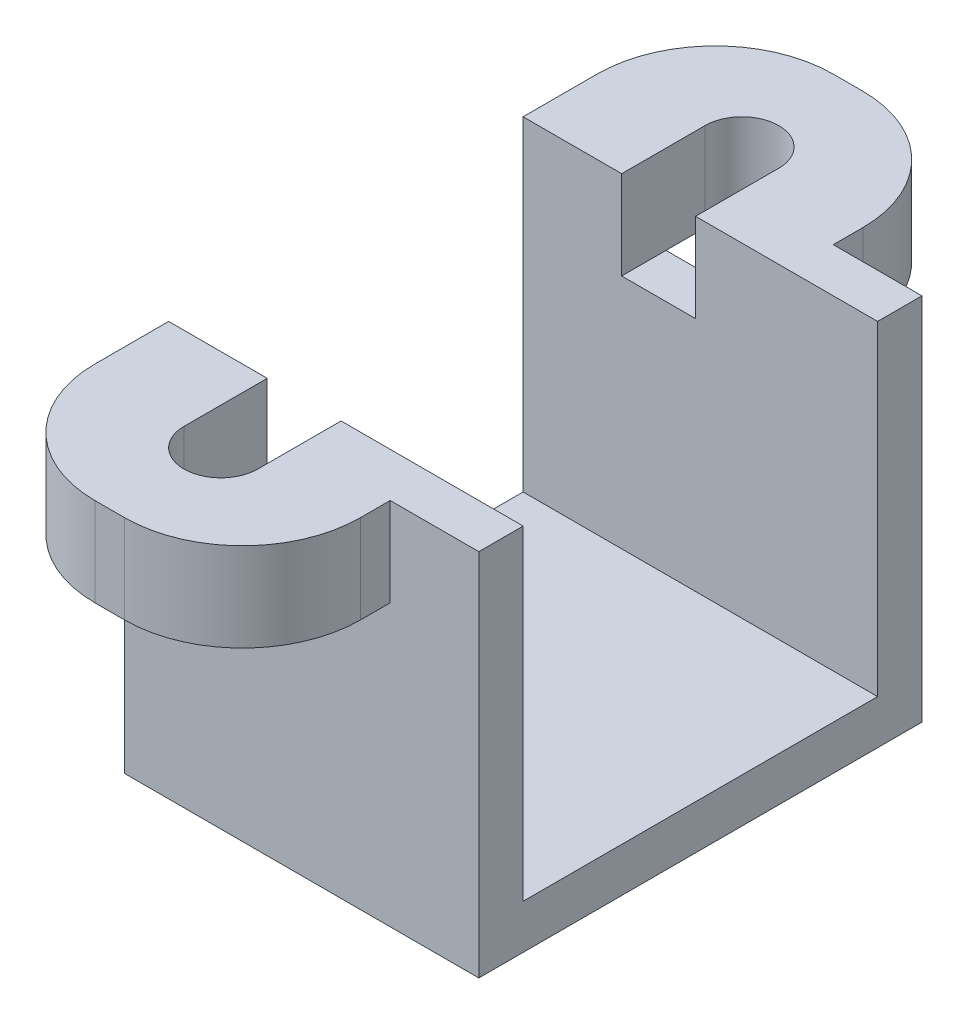
ISO-10303-21;
HEADER;
FILE_DESCRIPTION(('STEP AP214'),'2;1');
FILE_NAME('part.step','',(''),(''),'','','');
FILE_SCHEMA(('AUTOMOTIVE_DESIGN { 1 0 10303 214 1 1 1 1 }'));
ENDSEC;
DATA;
#1=APPLICATION_CONTEXT('core data for automotive mechanical design processes');
#2=APPLICATION_PROTOCOL_DEFINITION('international standard','automotive_design',2000,#1);
#3=PRODUCT_CONTEXT('',#1,'mechanical');
#4=PRODUCT('Part','Part','',(#3));
#5=PRODUCT_RELATED_PRODUCT_CATEGORY('part','',(#4));
#6=PRODUCT_DEFINITION_FORMATION('','',#4);
#7=PRODUCT_DEFINITION_CONTEXT('part definition',#1,'design');
#8=PRODUCT_DEFINITION('design','',#6,#7);
#9=PRODUCT_DEFINITION_SHAPE('','',#8);
#10=(LENGTH_UNIT() NAMED_UNIT(*) SI_UNIT(.MILLI.,.METRE.));
#11=(NAMED_UNIT(*) PLANE_ANGLE_UNIT() SI_UNIT($,.RADIAN.));
#12=(NAMED_UNIT(*) SI_UNIT($,.STERADIAN.) SOLID_ANGLE_UNIT());
#13=UNCERTAINTY_MEASURE_WITH_UNIT(LENGTH_MEASURE(1.E-05),#10,'distance_accuracy_value','');
#14=(GEOMETRIC_REPRESENTATION_CONTEXT(3) GLOBAL_UNCERTAINTY_ASSIGNED_CONTEXT((#13)) GLOBAL_UNIT_ASSIGNED_CONTEXT((#10,
#11,#12)) REPRESENTATION_CONTEXT('',''));
#15=CARTESIAN_POINT('',(0.,0.,0.));
#16=DIRECTION('',(0.,0.,1.));
#17=DIRECTION('',(1.,0.,0.));
#18=AXIS2_PLACEMENT_3D('',#15,#16,#17);
#19=CARTESIAN_POINT('',(-6.,12.5,-6.));
#20=DIRECTION('',(0.,0.,-1.));
#21=DIRECTION('',(-1.,0.,0.));
#22=AXIS2_PLACEMENT_3D('',#19,#20,#21);
#23=PLANE('',#22);
#24=DIRECTION('',(0.,-1.,0.));
#25=VECTOR('',#24,1.);
#26=CARTESIAN_POINT('',(-2.66316566960982,12.500012,-6.));
#27=LINE('',#26,#25);
#28=CARTESIAN_POINT('',(-2.66316566960982,12.5,-6.));
#29=VERTEX_POINT('',#28);
#30=CARTESIAN_POINT('',(-2.66316566960982,9.5,-6.));
#31=VERTEX_POINT('',#30);
#32=EDGE_CURVE('E220',#29,#31,#27,.T.);
#33=ORIENTED_EDGE('',*,*,#32,.F.);
#34=DIRECTION('',(1.,0.,0.));
#35=VECTOR('',#34,1.);
#36=CARTESIAN_POINT('',(-6.,12.5,-6.));
#37=LINE('',#36,#35);
#38=CARTESIAN_POINT('',(-6.,12.5,-6.));
#39=VERTEX_POINT('',#38);
#40=EDGE_CURVE('E350',#39,#29,#37,.T.);
#41=ORIENTED_EDGE('',*,*,#40,.F.);
#42=DIRECTION('',(0.,-1.,0.));
#43=VECTOR('',#42,1.);
#44=CARTESIAN_POINT('',(-6.,12.5,-6.));
#45=LINE('',#44,#43);
#46=CARTESIAN_POINT('',(-6.,1.5,-6.));
#47=VERTEX_POINT('',#46);
#48=EDGE_CURVE('E363',#39,#47,#45,.T.);
#49=ORIENTED_EDGE('',*,*,#48,.T.);
#50=DIRECTION('',(1.,0.,0.));
#51=VECTOR('',#50,1.);
#52=CARTESIAN_POINT('',(-6.,1.5,-6.));
#53=LINE('',#52,#51);
#54=CARTESIAN_POINT('',(6.,1.5,-6.));
#55=VERTEX_POINT('',#54);
#56=EDGE_CURVE('E346',#47,#55,#53,.T.);
#57=ORIENTED_EDGE('',*,*,#56,.T.);
#58=DIRECTION('',(0.,-1.,0.));
#59=VECTOR('',#58,1.);
#60=CARTESIAN_POINT('',(6.,12.5,-6.));
#61=LINE('',#60,#59);
#62=CARTESIAN_POINT('',(6.,12.5,-6.));
#63=VERTEX_POINT('',#62);
#64=EDGE_CURVE('E358',#63,#55,#61,.T.);
#65=ORIENTED_EDGE('',*,*,#64,.F.);
#66=CARTESIAN_POINT('',(-0.163165669609821,12.5,-6.));
#67=VERTEX_POINT('',#66);
#68=EDGE_CURVE('E349',#67,#63,#37,.T.);
#69=ORIENTED_EDGE('',*,*,#68,.F.);
#70=DIRECTION('',(0.,-1.,0.));
#71=VECTOR('',#70,1.);
#72=CARTESIAN_POINT('',(-0.163165669609821,12.500012,-6.));
#73=LINE('',#72,#71);
#74=CARTESIAN_POINT('',(-0.163165669609821,9.5,-6.));
#75=VERTEX_POINT('',#74);
#76=EDGE_CURVE('E232',#67,#75,#73,.T.);
#77=ORIENTED_EDGE('',*,*,#76,.T.);
#78=DIRECTION('',(1.,0.,0.));
#79=VECTOR('',#78,1.);
#80=CARTESIAN_POINT('',(-2.66316566960982,9.5,-6.));
#81=LINE('',#80,#79);
#82=EDGE_CURVE('E237',#31,#75,#81,.T.);
#83=ORIENTED_EDGE('',*,*,#82,.F.);
#84=EDGE_LOOP('',(#33,#41,#49,#57,#65,#69,#77,#83));
#85=FACE_BOUND('',#84,.T.);
#86=ADVANCED_FACE('F35',(#85),#23,.F.);
#87=CARTESIAN_POINT('',(0.,12.5,0.));
#88=DIRECTION('',(0.,1.,0.));
#89=DIRECTION('',(0.,0.,1.));
#90=AXIS2_PLACEMENT_3D('',#87,#88,#89);
#91=PLANE('',#90);
#92=ORIENTED_EDGE('',*,*,#40,.T.);
#93=DIRECTION('',(0.,0.,-1.));
#94=VECTOR('',#93,1.);
#95=CARTESIAN_POINT('',(-2.66316566960982,12.5,0.));
#96=LINE('',#95,#94);
#97=CARTESIAN_POINT('',(-2.66316566960982,12.5,-8.81925025844396));
#98=VERTEX_POINT('',#97);
#99=EDGE_CURVE('E226',#29,#98,#96,.T.);
#100=ORIENTED_EDGE('',*,*,#99,.T.);
#101=CARTESIAN_POINT('',(-1.41316566960982,12.5,-8.81925025844396));
#102=DIRECTION('',(0.,1.,0.));
#103=DIRECTION('',(0.,0.,1.));
#104=AXIS2_PLACEMENT_3D('',#101,#102,#103);
#105=CIRCLE('',#104,1.25);
#106=CARTESIAN_POINT('',(-0.16316566960982,12.5,-8.81925025844396));
#107=VERTEX_POINT('',#106);
#108=EDGE_CURVE('E282',#107,#98,#105,.T.);
#109=ORIENTED_EDGE('',*,*,#108,.F.);
#110=DIRECTION('',(0.,0.,1.));
#111=VECTOR('',#110,1.);
#112=CARTESIAN_POINT('',(-0.163165669609822,12.5,0.));
#113=LINE('',#112,#111);
#114=EDGE_CURVE('E283',#107,#67,#113,.T.);
#115=ORIENTED_EDGE('',*,*,#114,.T.);
#116=ORIENTED_EDGE('',*,*,#68,.T.);
#117=DIRECTION('',(0.,0.,-1.));
#118=VECTOR('',#117,1.);
#119=CARTESIAN_POINT('',(6.,12.5,-7.5));
#120=LINE('',#119,#118);
#121=CARTESIAN_POINT('',(6.,12.5,-7.5));
#122=VERTEX_POINT('',#121);
#123=EDGE_CURVE('E352',#63,#122,#120,.T.);
#124=ORIENTED_EDGE('',*,*,#123,.T.);
#125=DIRECTION('',(-1.,0.,0.));
#126=VECTOR('',#125,1.);
#127=CARTESIAN_POINT('',(-6.,12.5,-7.5));
#128=LINE('',#127,#126);
#129=CARTESIAN_POINT('',(3.,12.5,-7.5));
#130=VERTEX_POINT('',#129);
#131=EDGE_CURVE('E355',#122,#130,#128,.T.);
#132=ORIENTED_EDGE('',*,*,#131,.T.);
#133=DIRECTION('',(0.,0.,-1.));
#134=VECTOR('',#133,1.);
#135=CARTESIAN_POINT('',(3.,12.5,-6.));
#136=LINE('',#135,#134);
#137=CARTESIAN_POINT('',(3.,12.5,-8.5));
#138=VERTEX_POINT('',#137);
#139=EDGE_CURVE('E306',#130,#138,#136,.T.);
#140=ORIENTED_EDGE('',*,*,#139,.T.);
#141=CARTESIAN_POINT('',(-1.,12.5,-8.5));
#142=DIRECTION('',(0.,1.,0.));
#143=DIRECTION('',(0.,0.,1.));
#144=AXIS2_PLACEMENT_3D('',#141,#142,#143);
#145=CIRCLE('',#144,4.);
#146=CARTESIAN_POINT('',(-1.,12.5,-12.5));
#147=VERTEX_POINT('',#146);
#148=EDGE_CURVE('E396',#138,#147,#145,.T.);
#149=ORIENTED_EDGE('',*,*,#148,.T.);
#150=DIRECTION('',(-1.,0.,0.));
#151=VECTOR('',#150,1.);
#152=CARTESIAN_POINT('',(-6.,12.5,-12.5));
#153=LINE('',#152,#151);
#154=CARTESIAN_POINT('',(-2.,12.5,-12.5));
#155=VERTEX_POINT('',#154);
#156=EDGE_CURVE('E311',#147,#155,#153,.T.);
#157=ORIENTED_EDGE('',*,*,#156,.T.);
#158=CARTESIAN_POINT('',(-2.,12.5,-8.5));
#159=DIRECTION('',(0.,1.,0.));
#160=DIRECTION('',(0.,0.,1.));
#161=AXIS2_PLACEMENT_3D('',#158,#159,#160);
#162=CIRCLE('',#161,4.);
#163=CARTESIAN_POINT('',(-6.,12.5,-8.5));
#164=VERTEX_POINT('',#163);
#165=EDGE_CURVE('E394',#155,#164,#162,.T.);
#166=ORIENTED_EDGE('',*,*,#165,.T.);
#167=DIRECTION('',(0.,0.,1.));
#168=VECTOR('',#167,1.);
#169=CARTESIAN_POINT('',(-6.,12.5,-7.5));
#170=LINE('',#169,#168);
#171=EDGE_CURVE('E347',#164,#39,#170,.T.);
#172=ORIENTED_EDGE('',*,*,#171,.T.);
#173=EDGE_LOOP('',(#92,#100,#109,#115,#116,#124,#132,#140,#149,#157,#166,#172));
#174=FACE_BOUND('',#173,.T.);
#175=ADVANCED_FACE('F497',(#174),#91,.T.);
#176=CARTESIAN_POINT('',(-6.,12.5,6.));
#177=DIRECTION('',(0.,0.,1.));
#178=DIRECTION('',(1.,0.,0.));
#179=AXIS2_PLACEMENT_3D('',#176,#177,#178);
#180=PLANE('',#179);
#181=DIRECTION('',(0.,-1.,0.));
#182=VECTOR('',#181,1.);
#183=CARTESIAN_POINT('',(-0.163165669609821,12.500012,6.));
#184=LINE('',#183,#182);
#185=CARTESIAN_POINT('',(-0.163165669609821,12.5,6.));
#186=VERTEX_POINT('',#185);
#187=CARTESIAN_POINT('',(-0.163165669609821,9.5,6.));
#188=VERTEX_POINT('',#187);
#189=EDGE_CURVE('E275',#186,#188,#184,.T.);
#190=ORIENTED_EDGE('',*,*,#189,.F.);
#191=DIRECTION('',(-1.,0.,0.));
#192=VECTOR('',#191,1.);
#193=CARTESIAN_POINT('',(-6.,12.5,6.));
#194=LINE('',#193,#192);
#195=CARTESIAN_POINT('',(6.,12.5,6.));
#196=VERTEX_POINT('',#195);
#197=EDGE_CURVE('E337',#196,#186,#194,.T.);
#198=ORIENTED_EDGE('',*,*,#197,.F.);
#199=DIRECTION('',(0.,-1.,0.));
#200=VECTOR('',#199,1.);
#201=CARTESIAN_POINT('',(6.,12.5,6.));
#202=LINE('',#201,#200);
#203=CARTESIAN_POINT('',(6.,1.5,6.));
#204=VERTEX_POINT('',#203);
#205=EDGE_CURVE('E344',#196,#204,#202,.T.);
#206=ORIENTED_EDGE('',*,*,#205,.T.);
#207=DIRECTION('',(-1.,0.,0.));
#208=VECTOR('',#207,1.);
#209=CARTESIAN_POINT('',(-6.,1.5,6.));
#210=LINE('',#209,#208);
#211=CARTESIAN_POINT('',(-6.,1.5,6.));
#212=VERTEX_POINT('',#211);
#213=EDGE_CURVE('E328',#204,#212,#210,.T.);
#214=ORIENTED_EDGE('',*,*,#213,.T.);
#215=DIRECTION('',(0.,-1.,0.));
#216=VECTOR('',#215,1.);
#217=CARTESIAN_POINT('',(-6.,12.5,6.));
#218=LINE('',#217,#216);
#219=CARTESIAN_POINT('',(-6.,12.5,6.));
#220=VERTEX_POINT('',#219);
#221=EDGE_CURVE('E340',#220,#212,#218,.T.);
#222=ORIENTED_EDGE('',*,*,#221,.F.);
#223=CARTESIAN_POINT('',(-2.66316566960982,12.5,6.));
#224=VERTEX_POINT('',#223);
#225=EDGE_CURVE('E336',#224,#220,#194,.T.);
#226=ORIENTED_EDGE('',*,*,#225,.F.);
#227=DIRECTION('',(0.,-1.,0.));
#228=VECTOR('',#227,1.);
#229=CARTESIAN_POINT('',(-2.66316566960982,12.500012,6.));
#230=LINE('',#229,#228);
#231=CARTESIAN_POINT('',(-2.66316566960982,9.5,6.));
#232=VERTEX_POINT('',#231);
#233=EDGE_CURVE('E271',#224,#232,#230,.T.);
#234=ORIENTED_EDGE('',*,*,#233,.T.);
#235=DIRECTION('',(-1.,0.,0.));
#236=VECTOR('',#235,1.);
#237=CARTESIAN_POINT('',(-2.66316566960982,9.5,6.));
#238=LINE('',#237,#236);
#239=EDGE_CURVE('E263',#188,#232,#238,.T.);
#240=ORIENTED_EDGE('',*,*,#239,.F.);
#241=EDGE_LOOP('',(#190,#198,#206,#214,#222,#226,#234,#240));
#242=FACE_BOUND('',#241,.T.);
#243=ADVANCED_FACE('F467',(#242),#180,.F.);
#244=CARTESIAN_POINT('',(0.,12.5,0.));
#245=DIRECTION('',(0.,-1.,0.));
#246=DIRECTION('',(0.,0.,-1.));
#247=AXIS2_PLACEMENT_3D('',#244,#245,#246);
#248=PLANE('',#247);
#249=DIRECTION('',(0.,0.,1.));
#250=VECTOR('',#249,1.);
#251=CARTESIAN_POINT('',(-6.,12.5,7.5));
#252=LINE('',#251,#250);
#253=CARTESIAN_POINT('',(-6.,12.5,8.5));
#254=VERTEX_POINT('',#253);
#255=EDGE_CURVE('E329',#220,#254,#252,.T.);
#256=ORIENTED_EDGE('',*,*,#255,.T.);
#257=CARTESIAN_POINT('',(-2.,12.5,8.5));
#258=DIRECTION('',(0.,-1.,0.));
#259=DIRECTION('',(0.,0.,-1.));
#260=AXIS2_PLACEMENT_3D('',#257,#258,#259);
#261=CIRCLE('',#260,4.);
#262=CARTESIAN_POINT('',(-2.,12.5,12.5));
#263=VERTEX_POINT('',#262);
#264=EDGE_CURVE('E424',#254,#263,#261,.F.);
#265=ORIENTED_EDGE('',*,*,#264,.T.);
#266=DIRECTION('',(1.,0.,0.));
#267=VECTOR('',#266,1.);
#268=CARTESIAN_POINT('',(-6.,12.5,12.5));
#269=LINE('',#268,#267);
#270=CARTESIAN_POINT('',(-1.,12.5,12.5));
#271=VERTEX_POINT('',#270);
#272=EDGE_CURVE('E287',#263,#271,#269,.T.);
#273=ORIENTED_EDGE('',*,*,#272,.T.);
#274=CARTESIAN_POINT('',(-1.,12.5,8.5));
#275=DIRECTION('',(0.,-1.,0.));
#276=DIRECTION('',(0.,0.,-1.));
#277=AXIS2_PLACEMENT_3D('',#274,#275,#276);
#278=CIRCLE('',#277,4.);
#279=CARTESIAN_POINT('',(3.,12.5,8.5));
#280=VERTEX_POINT('',#279);
#281=EDGE_CURVE('E422',#271,#280,#278,.F.);
#282=ORIENTED_EDGE('',*,*,#281,.T.);
#283=DIRECTION('',(0.,0.,-1.));
#284=VECTOR('',#283,1.);
#285=CARTESIAN_POINT('',(3.,12.5,6.));
#286=LINE('',#285,#284);
#287=CARTESIAN_POINT('',(3.,12.5,7.5));
#288=VERTEX_POINT('',#287);
#289=EDGE_CURVE('E292',#280,#288,#286,.T.);
#290=ORIENTED_EDGE('',*,*,#289,.T.);
#291=DIRECTION('',(1.,0.,0.));
#292=VECTOR('',#291,1.);
#293=CARTESIAN_POINT('',(-6.,12.5,7.5));
#294=LINE('',#293,#292);
#295=CARTESIAN_POINT('',(6.,12.5,7.5));
#296=VERTEX_POINT('',#295);
#297=EDGE_CURVE('E332',#288,#296,#294,.T.);
#298=ORIENTED_EDGE('',*,*,#297,.T.);
#299=DIRECTION('',(0.,0.,-1.));
#300=VECTOR('',#299,1.);
#301=CARTESIAN_POINT('',(6.,12.5,7.5));
#302=LINE('',#301,#300);
#303=EDGE_CURVE('E334',#296,#196,#302,.T.);
#304=ORIENTED_EDGE('',*,*,#303,.T.);
#305=ORIENTED_EDGE('',*,*,#197,.T.);
#306=DIRECTION('',(0.,0.,-1.));
#307=VECTOR('',#306,1.);
#308=CARTESIAN_POINT('',(-0.163165669609822,12.5,0.));
#309=LINE('',#308,#307);
#310=CARTESIAN_POINT('',(-0.16316566960982,12.5,8.81925025844396));
#311=VERTEX_POINT('',#310);
#312=EDGE_CURVE('E280',#311,#186,#309,.T.);
#313=ORIENTED_EDGE('',*,*,#312,.F.);
#314=CARTESIAN_POINT('',(-1.41316566960982,12.5,8.81925025844396));
#315=DIRECTION('',(0.,1.,0.));
#316=DIRECTION('',(0.,0.,1.));
#317=AXIS2_PLACEMENT_3D('',#314,#315,#316);
#318=CIRCLE('',#317,1.25);
#319=CARTESIAN_POINT('',(-2.66316566960982,12.5,8.81925025844396));
#320=VERTEX_POINT('',#319);
#321=EDGE_CURVE('E231',#320,#311,#318,.T.);
#322=ORIENTED_EDGE('',*,*,#321,.F.);
#323=DIRECTION('',(0.,0.,1.));
#324=VECTOR('',#323,1.);
#325=CARTESIAN_POINT('',(-2.66316566960982,12.5,0.));
#326=LINE('',#325,#324);
#327=EDGE_CURVE('E277',#224,#320,#326,.T.);
#328=ORIENTED_EDGE('',*,*,#327,.F.);
#329=ORIENTED_EDGE('',*,*,#225,.T.);
#330=EDGE_LOOP('',(#256,#265,#273,#282,#290,#298,#304,#305,#313,#322,#328,#329));
#331=FACE_BOUND('',#330,.T.);
#332=ADVANCED_FACE('F445',(#331),#248,.F.);
#333=CARTESIAN_POINT('',(0.,9.5,0.));
#334=DIRECTION('',(0.,-1.,0.));
#335=DIRECTION('',(0.,0.,-1.));
#336=AXIS2_PLACEMENT_3D('',#333,#334,#335);
#337=PLANE('',#336);
#338=CARTESIAN_POINT('',(-1.41316566960982,9.5,-8.81925025844396));
#339=DIRECTION('',(0.,1.,0.));
#340=DIRECTION('',(0.,0.,1.));
#341=AXIS2_PLACEMENT_3D('',#338,#339,#340);
#342=CIRCLE('',#341,1.25);
#343=CARTESIAN_POINT('',(-0.16316566960982,9.5,-8.81925025844396));
#344=VERTEX_POINT('',#343);
#345=CARTESIAN_POINT('',(-2.66316566960982,9.5,-8.81925025844396));
#346=VERTEX_POINT('',#345);
#347=EDGE_CURVE('E242',#344,#346,#342,.T.);
#348=ORIENTED_EDGE('',*,*,#347,.T.);
#349=DIRECTION('',(0.,0.,1.));
#350=VECTOR('',#349,1.);
#351=CARTESIAN_POINT('',(-2.66316566960982,9.5,-8.81925025844396));
#352=LINE('',#351,#350);
#353=CARTESIAN_POINT('',(-2.66316566960982,9.5,-7.5));
#354=VERTEX_POINT('',#353);
#355=EDGE_CURVE('E241',#346,#354,#352,.T.);
#356=ORIENTED_EDGE('',*,*,#355,.T.);
#357=DIRECTION('',(1.,0.,0.));
#358=VECTOR('',#357,1.);
#359=CARTESIAN_POINT('',(-6.,9.5,-7.5));
#360=LINE('',#359,#358);
#361=CARTESIAN_POINT('',(-6.,9.5,-7.5));
#362=VERTEX_POINT('',#361);
#363=EDGE_CURVE('E325',#362,#354,#360,.T.);
#364=ORIENTED_EDGE('',*,*,#363,.F.);
#365=DIRECTION('',(0.,0.,1.));
#366=VECTOR('',#365,1.);
#367=CARTESIAN_POINT('',(-6.,9.5,-6.));
#368=LINE('',#367,#366);
#369=CARTESIAN_POINT('',(-6.,9.5,-8.5));
#370=VERTEX_POINT('',#369);
#371=EDGE_CURVE('E308',#370,#362,#368,.T.);
#372=ORIENTED_EDGE('',*,*,#371,.F.);
#373=CARTESIAN_POINT('',(-2.,9.5,-8.5));
#374=DIRECTION('',(0.,-1.,0.));
#375=DIRECTION('',(0.,0.,-1.));
#376=AXIS2_PLACEMENT_3D('',#373,#374,#375);
#377=CIRCLE('',#376,4.);
#378=CARTESIAN_POINT('',(-2.,9.5,-12.5));
#379=VERTEX_POINT('',#378);
#380=EDGE_CURVE('E403',#370,#379,#377,.T.);
#381=ORIENTED_EDGE('',*,*,#380,.T.);
#382=DIRECTION('',(-1.,0.,0.));
#383=VECTOR('',#382,1.);
#384=CARTESIAN_POINT('',(-6.,9.5,-12.5));
#385=LINE('',#384,#383);
#386=CARTESIAN_POINT('',(-1.,9.5,-12.5));
#387=VERTEX_POINT('',#386);
#388=EDGE_CURVE('E314',#387,#379,#385,.T.);
#389=ORIENTED_EDGE('',*,*,#388,.F.);
#390=CARTESIAN_POINT('',(-1.,9.5,-8.5));
#391=DIRECTION('',(0.,-1.,0.));
#392=DIRECTION('',(0.,0.,-1.));
#393=AXIS2_PLACEMENT_3D('',#390,#391,#392);
#394=CIRCLE('',#393,4.);
#395=CARTESIAN_POINT('',(3.,9.5,-8.5));
#396=VERTEX_POINT('',#395);
#397=EDGE_CURVE('E405',#387,#396,#394,.T.);
#398=ORIENTED_EDGE('',*,*,#397,.T.);
#399=DIRECTION('',(0.,0.,-1.));
#400=VECTOR('',#399,1.);
#401=CARTESIAN_POINT('',(3.,9.5,-6.));
#402=LINE('',#401,#400);
#403=CARTESIAN_POINT('',(3.,9.5,-7.5));
#404=VERTEX_POINT('',#403);
#405=EDGE_CURVE('E310',#404,#396,#402,.T.);
#406=ORIENTED_EDGE('',*,*,#405,.F.);
#407=CARTESIAN_POINT('',(-0.16316566960982,9.5,-7.5));
#408=VERTEX_POINT('',#407);
#409=EDGE_CURVE('E324',#408,#404,#360,.T.);
#410=ORIENTED_EDGE('',*,*,#409,.F.);
#411=DIRECTION('',(0.,0.,-1.));
#412=VECTOR('',#411,1.);
#413=CARTESIAN_POINT('',(-0.163165669609822,9.5,0.));
#414=LINE('',#413,#412);
#415=EDGE_CURVE('E412',#408,#344,#414,.T.);
#416=ORIENTED_EDGE('',*,*,#415,.T.);
#417=EDGE_LOOP('',(#348,#356,#364,#372,#381,#389,#398,#406,#410,#416));
#418=FACE_BOUND('',#417,.T.);
#419=ADVANCED_FACE('F508',(#418),#337,.T.);
#420=CARTESIAN_POINT('',(0.,9.5,0.));
#421=DIRECTION('',(0.,-1.,0.));
#422=DIRECTION('',(0.,0.,-1.));
#423=AXIS2_PLACEMENT_3D('',#420,#421,#422);
#424=PLANE('',#423);
#425=DIRECTION('',(1.,0.,0.));
#426=VECTOR('',#425,1.);
#427=CARTESIAN_POINT('',(-6.,9.5,12.5));
#428=LINE('',#427,#426);
#429=CARTESIAN_POINT('',(-2.,9.5,12.5));
#430=VERTEX_POINT('',#429);
#431=CARTESIAN_POINT('',(-1.,9.5,12.5));
#432=VERTEX_POINT('',#431);
#433=EDGE_CURVE('E291',#430,#432,#428,.T.);
#434=ORIENTED_EDGE('',*,*,#433,.F.);
#435=CARTESIAN_POINT('',(-2.,9.5,8.5));
#436=DIRECTION('',(0.,-1.,0.));
#437=DIRECTION('',(0.,0.,-1.));
#438=AXIS2_PLACEMENT_3D('',#435,#436,#437);
#439=CIRCLE('',#438,4.);
#440=CARTESIAN_POINT('',(-6.,9.5,8.5));
#441=VERTEX_POINT('',#440);
#442=EDGE_CURVE('E43',#430,#441,#439,.T.);
#443=ORIENTED_EDGE('',*,*,#442,.T.);
#444=DIRECTION('',(0.,0.,1.));
#445=VECTOR('',#444,1.);
#446=CARTESIAN_POINT('',(-6.,9.5,6.));
#447=LINE('',#446,#445);
#448=CARTESIAN_POINT('',(-6.,9.5,7.5));
#449=VERTEX_POINT('',#448);
#450=EDGE_CURVE('E288',#449,#441,#447,.T.);
#451=ORIENTED_EDGE('',*,*,#450,.F.);
#452=DIRECTION('',(-1.,0.,0.));
#453=VECTOR('',#452,1.);
#454=CARTESIAN_POINT('',(-6.,9.5,7.5));
#455=LINE('',#454,#453);
#456=CARTESIAN_POINT('',(-2.66316566960982,9.5,7.5));
#457=VERTEX_POINT('',#456);
#458=EDGE_CURVE('E302',#457,#449,#455,.T.);
#459=ORIENTED_EDGE('',*,*,#458,.F.);
#460=DIRECTION('',(0.,0.,1.));
#461=VECTOR('',#460,1.);
#462=CARTESIAN_POINT('',(-2.66316566960982,9.5,0.));
#463=LINE('',#462,#461);
#464=CARTESIAN_POINT('',(-2.66316566960982,9.5,8.81925025844396));
#465=VERTEX_POINT('',#464);
#466=EDGE_CURVE('E409',#457,#465,#463,.T.);
#467=ORIENTED_EDGE('',*,*,#466,.T.);
#468=CARTESIAN_POINT('',(-1.41316566960982,9.5,8.81925025844396));
#469=DIRECTION('',(0.,1.,0.));
#470=DIRECTION('',(0.,0.,-1.));
#471=AXIS2_PLACEMENT_3D('',#468,#469,#470);
#472=CIRCLE('',#471,1.25);
#473=CARTESIAN_POINT('',(-0.16316566960982,9.5,8.81925025844396));
#474=VERTEX_POINT('',#473);
#475=EDGE_CURVE('E256',#465,#474,#472,.T.);
#476=ORIENTED_EDGE('',*,*,#475,.T.);
#477=DIRECTION('',(0.,0.,-1.));
#478=VECTOR('',#477,1.);
#479=CARTESIAN_POINT('',(-0.163165669609821,9.5,6.));
#480=LINE('',#479,#478);
#481=CARTESIAN_POINT('',(-0.16316566960982,9.5,7.5));
#482=VERTEX_POINT('',#481);
#483=EDGE_CURVE('E260',#474,#482,#480,.T.);
#484=ORIENTED_EDGE('',*,*,#483,.T.);
#485=CARTESIAN_POINT('',(3.,9.5,7.5));
#486=VERTEX_POINT('',#485);
#487=EDGE_CURVE('E303',#486,#482,#455,.T.);
#488=ORIENTED_EDGE('',*,*,#487,.F.);
#489=DIRECTION('',(0.,0.,-1.));
#490=VECTOR('',#489,1.);
#491=CARTESIAN_POINT('',(3.,9.5,6.));
#492=LINE('',#491,#490);
#493=CARTESIAN_POINT('',(3.,9.5,8.5));
#494=VERTEX_POINT('',#493);
#495=EDGE_CURVE('E294',#494,#486,#492,.T.);
#496=ORIENTED_EDGE('',*,*,#495,.F.);
#497=CARTESIAN_POINT('',(-1.,9.5,8.5));
#498=DIRECTION('',(0.,-1.,0.));
#499=DIRECTION('',(0.,0.,-1.));
#500=AXIS2_PLACEMENT_3D('',#497,#498,#499);
#501=CIRCLE('',#500,4.);
#502=EDGE_CURVE('E55',#494,#432,#501,.T.);
#503=ORIENTED_EDGE('',*,*,#502,.T.);
#504=EDGE_LOOP('',(#434,#443,#451,#459,#467,#476,#484,#488,#496,#503));
#505=FACE_BOUND('',#504,.T.);
#506=ADVANCED_FACE('F433',(#505),#424,.T.);
#507=CARTESIAN_POINT('',(0.,1.5,0.));
#508=DIRECTION('',(0.,1.,0.));
#509=DIRECTION('',(0.,0.,1.));
#510=AXIS2_PLACEMENT_3D('',#507,#508,#509);
#511=PLANE('',#510);
#512=DIRECTION('',(0.,0.,1.));
#513=VECTOR('',#512,1.);
#514=CARTESIAN_POINT('',(-6.,1.5,-7.5));
#515=LINE('',#514,#513);
#516=EDGE_CURVE('E368',#47,#212,#515,.T.);
#517=ORIENTED_EDGE('',*,*,#516,.T.);
#518=ORIENTED_EDGE('',*,*,#213,.F.);
#519=DIRECTION('',(0.,0.,-1.));
#520=VECTOR('',#519,1.);
#521=CARTESIAN_POINT('',(6.,1.5,-7.5));
#522=LINE('',#521,#520);
#523=EDGE_CURVE('E366',#204,#55,#522,.T.);
#524=ORIENTED_EDGE('',*,*,#523,.T.);
#525=ORIENTED_EDGE('',*,*,#56,.F.);
#526=EDGE_LOOP('',(#517,#518,#524,#525));
#527=FACE_BOUND('',#526,.T.);
#528=ADVANCED_FACE('F492',(#527),#511,.T.);
#529=CARTESIAN_POINT('',(6.,1.5,-7.5));
#530=DIRECTION('',(-1.,0.,0.));
#531=DIRECTION('',(0.,0.,1.));
#532=AXIS2_PLACEMENT_3D('',#529,#530,#531);
#533=PLANE('',#532);
#534=DIRECTION('',(0.,0.,-1.));
#535=VECTOR('',#534,1.);
#536=CARTESIAN_POINT('',(6.,0.,-7.5));
#537=LINE('',#536,#535);
#538=CARTESIAN_POINT('',(6.,0.,7.5));
#539=VERTEX_POINT('',#538);
#540=CARTESIAN_POINT('',(6.,0.,-7.5));
#541=VERTEX_POINT('',#540);
#542=EDGE_CURVE('E365',#539,#541,#537,.T.);
#543=ORIENTED_EDGE('',*,*,#542,.T.);
#544=DIRECTION('',(0.,-1.,0.));
#545=VECTOR('',#544,1.);
#546=CARTESIAN_POINT('',(6.,1.5,-7.5));
#547=LINE('',#546,#545);
#548=EDGE_CURVE('E388',#122,#541,#547,.T.);
#549=ORIENTED_EDGE('',*,*,#548,.F.);
#550=ORIENTED_EDGE('',*,*,#123,.F.);
#551=ORIENTED_EDGE('',*,*,#64,.T.);
#552=ORIENTED_EDGE('',*,*,#523,.F.);
#553=ORIENTED_EDGE('',*,*,#205,.F.);
#554=ORIENTED_EDGE('',*,*,#303,.F.);
#555=DIRECTION('',(0.,-1.,0.));
#556=VECTOR('',#555,1.);
#557=CARTESIAN_POINT('',(6.,1.5,7.5));
#558=LINE('',#557,#556);
#559=EDGE_CURVE('E372',#296,#539,#558,.T.);
#560=ORIENTED_EDGE('',*,*,#559,.T.);
#561=EDGE_LOOP('',(#543,#549,#550,#551,#552,#553,#554,#560));
#562=FACE_BOUND('',#561,.T.);
#563=ADVANCED_FACE('F463',(#562),#533,.F.);
#564=CARTESIAN_POINT('',(-6.,1.5,-7.5));
#565=DIRECTION('',(0.,0.,1.));
#566=DIRECTION('',(1.,0.,0.));
#567=AXIS2_PLACEMENT_3D('',#564,#565,#566);
#568=PLANE('',#567);
#569=ORIENTED_EDGE('',*,*,#363,.T.);
#570=EDGE_CURVE('E240',#354,#408,#360,.T.);
#571=ORIENTED_EDGE('',*,*,#570,.T.);
#572=ORIENTED_EDGE('',*,*,#409,.T.);
#573=DIRECTION('',(0.,1.,0.));
#574=VECTOR('',#573,1.);
#575=CARTESIAN_POINT('',(3.,1.5,-7.5));
#576=LINE('',#575,#574);
#577=EDGE_CURVE('E317',#404,#130,#576,.T.);
#578=ORIENTED_EDGE('',*,*,#577,.T.);
#579=ORIENTED_EDGE('',*,*,#131,.F.);
#580=ORIENTED_EDGE('',*,*,#548,.T.);
#581=DIRECTION('',(-1.,0.,0.));
#582=VECTOR('',#581,1.);
#583=CARTESIAN_POINT('',(-6.,0.,-7.5));
#584=LINE('',#583,#582);
#585=CARTESIAN_POINT('',(-6.,0.,-7.5));
#586=VERTEX_POINT('',#585);
#587=EDGE_CURVE('E375',#541,#586,#584,.T.);
#588=ORIENTED_EDGE('',*,*,#587,.T.);
#589=DIRECTION('',(0.,-1.,0.));
#590=VECTOR('',#589,1.);
#591=CARTESIAN_POINT('',(-6.,1.5,-7.5));
#592=LINE('',#591,#590);
#593=EDGE_CURVE('E386',#362,#586,#592,.T.);
#594=ORIENTED_EDGE('',*,*,#593,.F.);
#595=EDGE_LOOP('',(#569,#571,#572,#578,#579,#580,#588,#594));
#596=FACE_BOUND('',#595,.T.);
#597=ADVANCED_FACE('F499',(#596),#568,.F.);
#598=CARTESIAN_POINT('',(-6.,1.5,-7.5));
#599=DIRECTION('',(1.,0.,0.));
#600=DIRECTION('',(0.,0.,-1.));
#601=AXIS2_PLACEMENT_3D('',#598,#599,#600);
#602=PLANE('',#601);
#603=ORIENTED_EDGE('',*,*,#450,.T.);
#604=DIRECTION('',(0.,1.,0.));
#605=VECTOR('',#604,1.);
#606=CARTESIAN_POINT('',(-6.,12.5,8.5));
#607=LINE('',#606,#605);
#608=EDGE_CURVE('E415',#441,#254,#607,.T.);
#609=ORIENTED_EDGE('',*,*,#608,.T.);
#610=ORIENTED_EDGE('',*,*,#255,.F.);
#611=ORIENTED_EDGE('',*,*,#221,.T.);
#612=ORIENTED_EDGE('',*,*,#516,.F.);
#613=ORIENTED_EDGE('',*,*,#48,.F.);
#614=ORIENTED_EDGE('',*,*,#171,.F.);
#615=DIRECTION('',(0.,1.,0.));
#616=VECTOR('',#615,1.);
#617=CARTESIAN_POINT('',(-6.,9.5,-8.5));
#618=LINE('',#617,#616);
#619=EDGE_CURVE('E407',#164,#370,#618,.F.);
#620=ORIENTED_EDGE('',*,*,#619,.T.);
#621=ORIENTED_EDGE('',*,*,#371,.T.);
#622=ORIENTED_EDGE('',*,*,#593,.T.);
#623=DIRECTION('',(0.,0.,1.));
#624=VECTOR('',#623,1.);
#625=CARTESIAN_POINT('',(-6.,0.,-7.5));
#626=LINE('',#625,#624);
#627=CARTESIAN_POINT('',(-6.,0.,7.5));
#628=VERTEX_POINT('',#627);
#629=EDGE_CURVE('E378',#586,#628,#626,.T.);
#630=ORIENTED_EDGE('',*,*,#629,.T.);
#631=DIRECTION('',(0.,-1.,0.));
#632=VECTOR('',#631,1.);
#633=CARTESIAN_POINT('',(-6.,1.5,7.5));
#634=LINE('',#633,#632);
#635=EDGE_CURVE('E384',#449,#628,#634,.T.);
#636=ORIENTED_EDGE('',*,*,#635,.F.);
#637=EDGE_LOOP('',(#603,#609,#610,#611,#612,#613,#614,#620,#621,#622,#630,#636));
#638=FACE_BOUND('',#637,.T.);
#639=ADVANCED_FACE('F440',(#638),#602,.F.);
#640=CARTESIAN_POINT('',(-6.,1.5,7.5));
#641=DIRECTION('',(0.,0.,-1.));
#642=DIRECTION('',(-1.,0.,0.));
#643=AXIS2_PLACEMENT_3D('',#640,#641,#642);
#644=PLANE('',#643);
#645=ORIENTED_EDGE('',*,*,#297,.F.);
#646=DIRECTION('',(0.,-1.,0.));
#647=VECTOR('',#646,1.);
#648=CARTESIAN_POINT('',(3.,1.5,7.5));
#649=LINE('',#648,#647);
#650=EDGE_CURVE('E296',#288,#486,#649,.T.);
#651=ORIENTED_EDGE('',*,*,#650,.T.);
#652=ORIENTED_EDGE('',*,*,#487,.T.);
#653=EDGE_CURVE('E307',#482,#457,#455,.T.);
#654=ORIENTED_EDGE('',*,*,#653,.T.);
#655=ORIENTED_EDGE('',*,*,#458,.T.);
#656=ORIENTED_EDGE('',*,*,#635,.T.);
#657=DIRECTION('',(1.,0.,0.));
#658=VECTOR('',#657,1.);
#659=CARTESIAN_POINT('',(-6.,0.,7.5));
#660=LINE('',#659,#658);
#661=EDGE_CURVE('E369',#628,#539,#660,.T.);
#662=ORIENTED_EDGE('',*,*,#661,.T.);
#663=ORIENTED_EDGE('',*,*,#559,.F.);
#664=EDGE_LOOP('',(#645,#651,#652,#654,#655,#656,#662,#663));
#665=FACE_BOUND('',#664,.T.);
#666=ADVANCED_FACE('F456',(#665),#644,.F.);
#667=CARTESIAN_POINT('',(0.,0.,0.));
#668=DIRECTION('',(0.,1.,0.));
#669=DIRECTION('',(0.,0.,1.));
#670=AXIS2_PLACEMENT_3D('',#667,#668,#669);
#671=PLANE('',#670);
#672=ORIENTED_EDGE('',*,*,#542,.F.);
#673=ORIENTED_EDGE('',*,*,#661,.F.);
#674=ORIENTED_EDGE('',*,*,#629,.F.);
#675=ORIENTED_EDGE('',*,*,#587,.F.);
#676=EDGE_LOOP('',(#672,#673,#674,#675));
#677=FACE_BOUND('',#676,.T.);
#678=ADVANCED_FACE('F529',(#677),#671,.F.);
#679=CARTESIAN_POINT('',(3.,9.5,-6.));
#680=DIRECTION('',(1.,0.,0.));
#681=DIRECTION('',(0.,0.,-1.));
#682=AXIS2_PLACEMENT_3D('',#679,#680,#681);
#683=PLANE('',#682);
#684=ORIENTED_EDGE('',*,*,#405,.T.);
#685=DIRECTION('',(0.,1.,0.));
#686=VECTOR('',#685,1.);
#687=CARTESIAN_POINT('',(3.,9.5,-8.5));
#688=LINE('',#687,#686);
#689=EDGE_CURVE('E391',#396,#138,#688,.T.);
#690=ORIENTED_EDGE('',*,*,#689,.T.);
#691=ORIENTED_EDGE('',*,*,#139,.F.);
#692=ORIENTED_EDGE('',*,*,#577,.F.);
#693=EDGE_LOOP('',(#684,#690,#691,#692));
#694=FACE_BOUND('',#693,.T.);
#695=ADVANCED_FACE('F504',(#694),#683,.T.);
#696=CARTESIAN_POINT('',(-6.,9.5,-12.5));
#697=DIRECTION('',(0.,0.,-1.));
#698=DIRECTION('',(-1.,0.,0.));
#699=AXIS2_PLACEMENT_3D('',#696,#697,#698);
#700=PLANE('',#699);
#701=ORIENTED_EDGE('',*,*,#156,.F.);
#702=DIRECTION('',(0.,1.,0.));
#703=VECTOR('',#702,1.);
#704=CARTESIAN_POINT('',(-1.,9.5,-12.5));
#705=LINE('',#704,#703);
#706=EDGE_CURVE('E401',#147,#387,#705,.F.);
#707=ORIENTED_EDGE('',*,*,#706,.T.);
#708=ORIENTED_EDGE('',*,*,#388,.T.);
#709=DIRECTION('',(0.,1.,0.));
#710=VECTOR('',#709,1.);
#711=CARTESIAN_POINT('',(-2.,12.5,-12.5));
#712=LINE('',#711,#710);
#713=EDGE_CURVE('E398',#379,#155,#712,.T.);
#714=ORIENTED_EDGE('',*,*,#713,.T.);
#715=EDGE_LOOP('',(#701,#707,#708,#714));
#716=FACE_BOUND('',#715,.T.);
#717=ADVANCED_FACE('F516',(#716),#700,.T.);
#718=CARTESIAN_POINT('',(3.,9.5,6.));
#719=DIRECTION('',(1.,0.,0.));
#720=DIRECTION('',(0.,0.,-1.));
#721=AXIS2_PLACEMENT_3D('',#718,#719,#720);
#722=PLANE('',#721);
#723=ORIENTED_EDGE('',*,*,#289,.F.);
#724=DIRECTION('',(0.,1.,0.));
#725=VECTOR('',#724,1.);
#726=CARTESIAN_POINT('',(3.,9.5,8.5));
#727=LINE('',#726,#725);
#728=EDGE_CURVE('E11',#280,#494,#727,.F.);
#729=ORIENTED_EDGE('',*,*,#728,.T.);
#730=ORIENTED_EDGE('',*,*,#495,.T.);
#731=ORIENTED_EDGE('',*,*,#650,.F.);
#732=EDGE_LOOP('',(#723,#729,#730,#731));
#733=FACE_BOUND('',#732,.T.);
#734=ADVANCED_FACE('F451',(#733),#722,.T.);
#735=CARTESIAN_POINT('',(-6.,9.5,12.5));
#736=DIRECTION('',(0.,0.,1.));
#737=DIRECTION('',(1.,0.,0.));
#738=AXIS2_PLACEMENT_3D('',#735,#736,#737);
#739=PLANE('',#738);
#740=ORIENTED_EDGE('',*,*,#272,.F.);
#741=DIRECTION('',(0.,1.,0.));
#742=VECTOR('',#741,1.);
#743=CARTESIAN_POINT('',(-2.,9.5,12.5));
#744=LINE('',#743,#742);
#745=EDGE_CURVE('E429',#263,#430,#744,.F.);
#746=ORIENTED_EDGE('',*,*,#745,.T.);
#747=ORIENTED_EDGE('',*,*,#433,.T.);
#748=DIRECTION('',(0.,1.,0.));
#749=VECTOR('',#748,1.);
#750=CARTESIAN_POINT('',(-1.,9.5,12.5));
#751=LINE('',#750,#749);
#752=EDGE_CURVE('E426',#432,#271,#751,.T.);
#753=ORIENTED_EDGE('',*,*,#752,.T.);
#754=EDGE_LOOP('',(#740,#746,#747,#753));
#755=FACE_BOUND('',#754,.T.);
#756=ADVANCED_FACE('F447',(#755),#739,.T.);
#757=CARTESIAN_POINT('',(-1.,9.5,-8.5));
#758=DIRECTION('',(0.,1.,0.));
#759=DIRECTION('',(0.,0.,1.));
#760=AXIS2_PLACEMENT_3D('',#757,#758,#759);
#761=CYLINDRICAL_SURFACE('',#760,4.);
#762=ORIENTED_EDGE('',*,*,#397,.F.);
#763=ORIENTED_EDGE('',*,*,#706,.F.);
#764=ORIENTED_EDGE('',*,*,#148,.F.);
#765=ORIENTED_EDGE('',*,*,#689,.F.);
#766=EDGE_LOOP('',(#762,#763,#764,#765));
#767=FACE_BOUND('',#766,.T.);
#768=ADVANCED_FACE('F513',(#767),#761,.T.);
#769=CARTESIAN_POINT('',(-2.,9.5,-8.5));
#770=DIRECTION('',(0.,-1.,0.));
#771=DIRECTION('',(0.,0.,-1.));
#772=AXIS2_PLACEMENT_3D('',#769,#770,#771);
#773=CYLINDRICAL_SURFACE('',#772,4.);
#774=ORIENTED_EDGE('',*,*,#380,.F.);
#775=ORIENTED_EDGE('',*,*,#619,.F.);
#776=ORIENTED_EDGE('',*,*,#165,.F.);
#777=ORIENTED_EDGE('',*,*,#713,.F.);
#778=EDGE_LOOP('',(#774,#775,#776,#777));
#779=FACE_BOUND('',#778,.T.);
#780=ADVANCED_FACE('F520',(#779),#773,.T.);
#781=CARTESIAN_POINT('',(-1.41316566960982,9.5,8.81925025844396));
#782=DIRECTION('',(0.,-1.,0.));
#783=DIRECTION('',(0.,0.,-1.));
#784=AXIS2_PLACEMENT_3D('',#781,#782,#783);
#785=PLANE('',#784);
#786=EDGE_CURVE('E259',#482,#188,#480,.T.);
#787=ORIENTED_EDGE('',*,*,#786,.T.);
#788=ORIENTED_EDGE('',*,*,#239,.T.);
#789=DIRECTION('',(0.,0.,1.));
#790=VECTOR('',#789,1.);
#791=CARTESIAN_POINT('',(-2.66316566960982,9.5,8.81925025844396));
#792=LINE('',#791,#790);
#793=EDGE_CURVE('E265',#232,#457,#792,.T.);
#794=ORIENTED_EDGE('',*,*,#793,.T.);
#795=ORIENTED_EDGE('',*,*,#653,.F.);
#796=EDGE_LOOP('',(#787,#788,#794,#795));
#797=FACE_BOUND('',#796,.T.);
#798=ADVANCED_FACE('F474',(#797),#785,.F.);
#799=CARTESIAN_POINT('',(-0.163165669609821,12.500012,6.));
#800=DIRECTION('',(-1.,0.,0.));
#801=DIRECTION('',(0.,0.,1.));
#802=AXIS2_PLACEMENT_3D('',#799,#800,#801);
#803=PLANE('',#802);
#804=ORIENTED_EDGE('',*,*,#312,.T.);
#805=ORIENTED_EDGE('',*,*,#189,.T.);
#806=ORIENTED_EDGE('',*,*,#786,.F.);
#807=ORIENTED_EDGE('',*,*,#483,.F.);
#808=DIRECTION('',(0.,1.,0.));
#809=VECTOR('',#808,1.);
#810=CARTESIAN_POINT('',(-0.16316566960982,9.5,8.81925025844396));
#811=LINE('',#810,#809);
#812=EDGE_CURVE('E268',#474,#311,#811,.T.);
#813=ORIENTED_EDGE('',*,*,#812,.T.);
#814=EDGE_LOOP('',(#804,#805,#806,#807,#813));
#815=FACE_BOUND('',#814,.T.);
#816=ADVANCED_FACE('F472',(#815),#803,.T.);
#817=CARTESIAN_POINT('',(-2.66316566960982,12.500012,8.81925025844396));
#818=DIRECTION('',(1.,0.,0.));
#819=DIRECTION('',(0.,0.,-1.));
#820=AXIS2_PLACEMENT_3D('',#817,#818,#819);
#821=PLANE('',#820);
#822=ORIENTED_EDGE('',*,*,#327,.T.);
#823=DIRECTION('',(0.,1.,0.));
#824=VECTOR('',#823,1.);
#825=CARTESIAN_POINT('',(-2.66316566960982,9.5,8.81925025844396));
#826=LINE('',#825,#824);
#827=EDGE_CURVE('E269',#465,#320,#826,.T.);
#828=ORIENTED_EDGE('',*,*,#827,.F.);
#829=ORIENTED_EDGE('',*,*,#466,.F.);
#830=ORIENTED_EDGE('',*,*,#793,.F.);
#831=ORIENTED_EDGE('',*,*,#233,.F.);
#832=EDGE_LOOP('',(#822,#828,#829,#830,#831));
#833=FACE_BOUND('',#832,.T.);
#834=ADVANCED_FACE('F479',(#833),#821,.T.);
#835=CARTESIAN_POINT('',(-1.41316566960982,9.5,8.81925025844396));
#836=DIRECTION('',(0.,1.,0.));
#837=DIRECTION('',(0.,0.,1.));
#838=AXIS2_PLACEMENT_3D('',#835,#836,#837);
#839=CYLINDRICAL_SURFACE('',#838,1.25);
#840=ORIENTED_EDGE('',*,*,#812,.F.);
#841=ORIENTED_EDGE('',*,*,#475,.F.);
#842=ORIENTED_EDGE('',*,*,#827,.T.);
#843=ORIENTED_EDGE('',*,*,#321,.T.);
#844=EDGE_LOOP('',(#840,#841,#842,#843));
#845=FACE_BOUND('',#844,.T.);
#846=ADVANCED_FACE('F484',(#845),#839,.F.);
#847=CARTESIAN_POINT('',(-1.41316566960982,9.5,-8.81925025844396));
#848=DIRECTION('',(0.,1.,0.));
#849=DIRECTION('',(0.,0.,1.));
#850=AXIS2_PLACEMENT_3D('',#847,#848,#849);
#851=PLANE('',#850);
#852=ORIENTED_EDGE('',*,*,#570,.F.);
#853=EDGE_CURVE('E223',#354,#31,#352,.T.);
#854=ORIENTED_EDGE('',*,*,#853,.T.);
#855=ORIENTED_EDGE('',*,*,#82,.T.);
#856=DIRECTION('',(0.,0.,-1.));
#857=VECTOR('',#856,1.);
#858=CARTESIAN_POINT('',(-0.163165669609821,9.5,-6.));
#859=LINE('',#858,#857);
#860=EDGE_CURVE('E246',#75,#408,#859,.T.);
#861=ORIENTED_EDGE('',*,*,#860,.T.);
#862=EDGE_LOOP('',(#852,#854,#855,#861));
#863=FACE_BOUND('',#862,.T.);
#864=ADVANCED_FACE('F235',(#863),#851,.T.);
#865=CARTESIAN_POINT('',(-2.66316566960982,12.500012,-8.81925025844396));
#866=DIRECTION('',(1.,0.,0.));
#867=DIRECTION('',(0.,0.,-1.));
#868=AXIS2_PLACEMENT_3D('',#865,#866,#867);
#869=PLANE('',#868);
#870=ORIENTED_EDGE('',*,*,#32,.T.);
#871=ORIENTED_EDGE('',*,*,#853,.F.);
#872=ORIENTED_EDGE('',*,*,#355,.F.);
#873=DIRECTION('',(0.,1.,0.));
#874=VECTOR('',#873,1.);
#875=CARTESIAN_POINT('',(-2.66316566960982,9.5,-8.81925025844396));
#876=LINE('',#875,#874);
#877=EDGE_CURVE('E248',#346,#98,#876,.T.);
#878=ORIENTED_EDGE('',*,*,#877,.T.);
#879=ORIENTED_EDGE('',*,*,#99,.F.);
#880=EDGE_LOOP('',(#870,#871,#872,#878,#879));
#881=FACE_BOUND('',#880,.T.);
#882=ADVANCED_FACE('F222',(#881),#869,.T.);
#883=CARTESIAN_POINT('',(-0.163165669609821,12.500012,-6.));
#884=DIRECTION('',(-1.,0.,0.));
#885=DIRECTION('',(0.,0.,1.));
#886=AXIS2_PLACEMENT_3D('',#883,#884,#885);
#887=PLANE('',#886);
#888=DIRECTION('',(0.,1.,0.));
#889=VECTOR('',#888,1.);
#890=CARTESIAN_POINT('',(-0.16316566960982,9.5,-8.81925025844396));
#891=LINE('',#890,#889);
#892=EDGE_CURVE('E252',#344,#107,#891,.T.);
#893=ORIENTED_EDGE('',*,*,#892,.F.);
#894=ORIENTED_EDGE('',*,*,#415,.F.);
#895=ORIENTED_EDGE('',*,*,#860,.F.);
#896=ORIENTED_EDGE('',*,*,#76,.F.);
#897=ORIENTED_EDGE('',*,*,#114,.F.);
#898=EDGE_LOOP('',(#893,#894,#895,#896,#897));
#899=FACE_BOUND('',#898,.T.);
#900=ADVANCED_FACE('F653',(#899),#887,.T.);
#901=CARTESIAN_POINT('',(-1.41316566960982,9.5,-8.81925025844396));
#902=DIRECTION('',(0.,1.,0.));
#903=DIRECTION('',(0.,0.,1.));
#904=AXIS2_PLACEMENT_3D('',#901,#902,#903);
#905=CYLINDRICAL_SURFACE('',#904,1.25);
#906=ORIENTED_EDGE('',*,*,#108,.T.);
#907=ORIENTED_EDGE('',*,*,#877,.F.);
#908=ORIENTED_EDGE('',*,*,#347,.F.);
#909=ORIENTED_EDGE('',*,*,#892,.T.);
#910=EDGE_LOOP('',(#906,#907,#908,#909));
#911=FACE_BOUND('',#910,.T.);
#912=ADVANCED_FACE('F661',(#911),#905,.F.);
#913=CARTESIAN_POINT('',(-2.,1.5,8.5));
#914=DIRECTION('',(0.,-1.,0.));
#915=DIRECTION('',(0.,0.,-1.));
#916=AXIS2_PLACEMENT_3D('',#913,#914,#915);
#917=CYLINDRICAL_SURFACE('',#916,4.);
#918=ORIENTED_EDGE('',*,*,#442,.F.);
#919=ORIENTED_EDGE('',*,*,#745,.F.);
#920=ORIENTED_EDGE('',*,*,#264,.F.);
#921=ORIENTED_EDGE('',*,*,#608,.F.);
#922=EDGE_LOOP('',(#918,#919,#920,#921));
#923=FACE_BOUND('',#922,.T.);
#924=ADVANCED_FACE('F442',(#923),#917,.T.);
#925=CARTESIAN_POINT('',(-1.,9.5,8.5));
#926=DIRECTION('',(0.,1.,0.));
#927=DIRECTION('',(0.,0.,1.));
#928=AXIS2_PLACEMENT_3D('',#925,#926,#927);
#929=CYLINDRICAL_SURFACE('',#928,4.);
#930=ORIENTED_EDGE('',*,*,#502,.F.);
#931=ORIENTED_EDGE('',*,*,#728,.F.);
#932=ORIENTED_EDGE('',*,*,#281,.F.);
#933=ORIENTED_EDGE('',*,*,#752,.F.);
#934=EDGE_LOOP('',(#930,#931,#932,#933));
#935=FACE_BOUND('',#934,.T.);
#936=ADVANCED_FACE('F37',(#935),#929,.T.);
#937=CLOSED_SHELL('',(#86,#175,#243,#332,#419,#506,#528,#563,#597,#639,#666,#678,#695,#717,#734,
#756,#768,#780,#798,#816,#834,#846,#864,#882,#900,#912,#924,#936));
#938=MANIFOLD_SOLID_BREP('B2',#937);
#939=ADVANCED_BREP_SHAPE_REPRESENTATION('',(#18,#938),#14);
#940=SHAPE_DEFINITION_REPRESENTATION(#9,#939);
ENDSEC;
END-ISO-10303-21;
